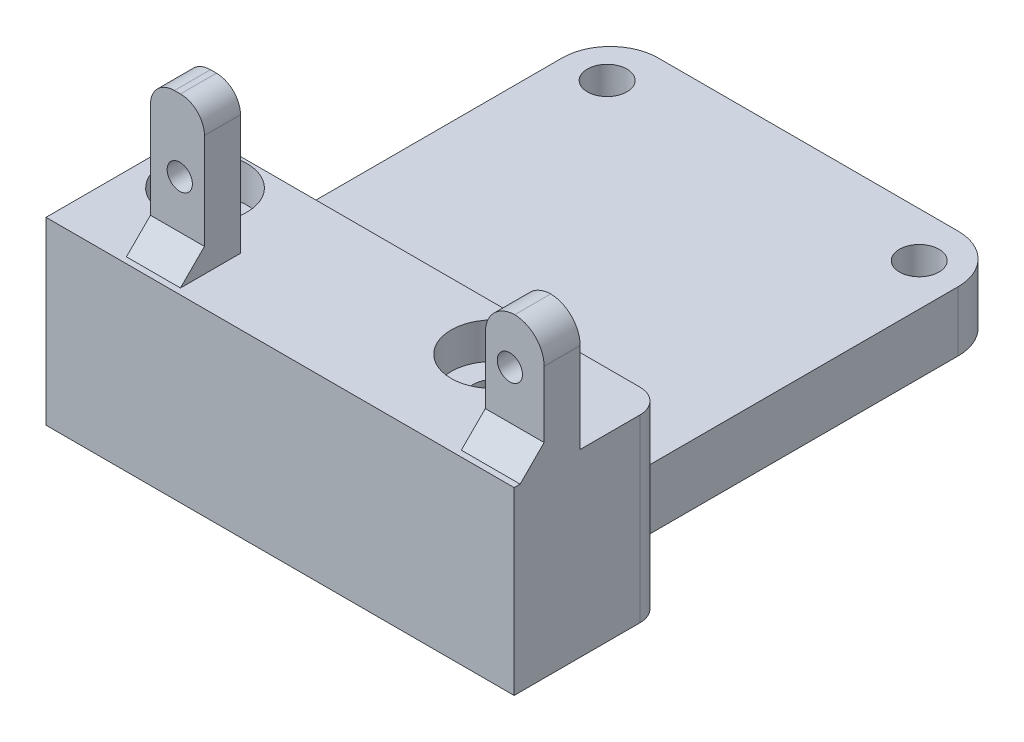
ISO-10303-21;
HEADER;
FILE_DESCRIPTION(('STEP AP214'),'2;1');
FILE_NAME('part.step','',(''),(''),'','','');
FILE_SCHEMA(('AUTOMOTIVE_DESIGN { 1 0 10303 214 1 1 1 1 }'));
ENDSEC;
DATA;
#1=APPLICATION_CONTEXT('core data for automotive mechanical design processes');
#2=APPLICATION_PROTOCOL_DEFINITION('international standard','automotive_design',2000,#1);
#3=PRODUCT_CONTEXT('',#1,'mechanical');
#4=PRODUCT('Part','Part','',(#3));
#5=PRODUCT_RELATED_PRODUCT_CATEGORY('part','',(#4));
#6=PRODUCT_DEFINITION_FORMATION('','',#4);
#7=PRODUCT_DEFINITION_CONTEXT('part definition',#1,'design');
#8=PRODUCT_DEFINITION('design','',#6,#7);
#9=PRODUCT_DEFINITION_SHAPE('','',#8);
#10=(LENGTH_UNIT() NAMED_UNIT(*) SI_UNIT(.MILLI.,.METRE.));
#11=(NAMED_UNIT(*) PLANE_ANGLE_UNIT() SI_UNIT($,.RADIAN.));
#12=(NAMED_UNIT(*) SI_UNIT($,.STERADIAN.) SOLID_ANGLE_UNIT());
#13=UNCERTAINTY_MEASURE_WITH_UNIT(LENGTH_MEASURE(1.E-05),#10,'distance_accuracy_value','');
#14=(GEOMETRIC_REPRESENTATION_CONTEXT(3) GLOBAL_UNCERTAINTY_ASSIGNED_CONTEXT((#13)) GLOBAL_UNIT_ASSIGNED_CONTEXT((#10,
#11,#12)) REPRESENTATION_CONTEXT('',''));
#15=CARTESIAN_POINT('',(0.,0.,0.));
#16=DIRECTION('',(0.,0.,1.));
#17=DIRECTION('',(1.,0.,0.));
#18=AXIS2_PLACEMENT_3D('',#15,#16,#17);
#19=CARTESIAN_POINT('',(0.,15.,0.));
#20=DIRECTION('',(0.,1.,0.));
#21=DIRECTION('',(0.,0.,1.));
#22=AXIS2_PLACEMENT_3D('',#19,#20,#21);
#23=PLANE('',#22);
#24=CARTESIAN_POINT('',(4.50000017881395,15.,-3.75));
#25=DIRECTION('',(0.,1.,0.));
#26=DIRECTION('',(0.,0.,1.));
#27=AXIS2_PLACEMENT_3D('',#24,#25,#26);
#28=CIRCLE('',#27,3.5);
#29=CARTESIAN_POINT('',(4.50000017881395,15.,-0.250000000000003));
#30=VERTEX_POINT('',#29);
#31=EDGE_CURVE('E266',#30,#30,#28,.T.);
#32=ORIENTED_EDGE('',*,*,#31,.F.);
#33=EDGE_LOOP('',(#32));
#34=FACE_BOUND('',#33,.T.);
#35=CARTESIAN_POINT('',(28.5,15.,-3.75));
#36=DIRECTION('',(0.,1.,0.));
#37=DIRECTION('',(0.,0.,1.));
#38=AXIS2_PLACEMENT_3D('',#35,#36,#37);
#39=CIRCLE('',#38,3.5);
#40=CARTESIAN_POINT('',(28.5,15.,-0.250000000000003));
#41=VERTEX_POINT('',#40);
#42=EDGE_CURVE('E272',#41,#41,#39,.T.);
#43=ORIENTED_EDGE('',*,*,#42,.F.);
#44=EDGE_LOOP('',(#43));
#45=FACE_BOUND('',#44,.T.);
#46=DIRECTION('',(0.,0.,-1.));
#47=VECTOR('',#46,1.);
#48=CARTESIAN_POINT('',(39.,15.,5.));
#49=LINE('',#48,#47);
#50=CARTESIAN_POINT('',(39.,15.,5.));
#51=VERTEX_POINT('',#50);
#52=CARTESIAN_POINT('',(39.,15.,4.50000000000001));
#53=VERTEX_POINT('',#52);
#54=EDGE_CURVE('E312',#51,#53,#49,.T.);
#55=ORIENTED_EDGE('',*,*,#54,.T.);
#56=DIRECTION('',(-1.,0.,0.));
#57=VECTOR('',#56,1.);
#58=CARTESIAN_POINT('',(0.,15.,4.50000000000001));
#59=LINE('',#58,#57);
#60=CARTESIAN_POINT('',(34.1,15.,4.50000000000001));
#61=VERTEX_POINT('',#60);
#62=EDGE_CURVE('E442',#53,#61,#59,.T.);
#63=ORIENTED_EDGE('',*,*,#62,.T.);
#64=DIRECTION('',(0.,0.,1.));
#65=VECTOR('',#64,1.);
#66=CARTESIAN_POINT('',(34.1,15.,-0.499999999999995));
#67=LINE('',#66,#65);
#68=CARTESIAN_POINT('',(34.1,15.,-0.499999999999995));
#69=VERTEX_POINT('',#68);
#70=EDGE_CURVE('E298',#69,#61,#67,.T.);
#71=ORIENTED_EDGE('',*,*,#70,.F.);
#72=DIRECTION('',(-1.,0.,0.));
#73=VECTOR('',#72,1.);
#74=CARTESIAN_POINT('',(39.,15.,-0.499999999999996));
#75=LINE('',#74,#73);
#76=CARTESIAN_POINT('',(39.,15.,-0.499999999999994));
#77=VERTEX_POINT('',#76);
#78=EDGE_CURVE('E295',#77,#69,#75,.T.);
#79=ORIENTED_EDGE('',*,*,#78,.F.);
#80=CARTESIAN_POINT('',(39.,15.,-5.49069428315726));
#81=VERTEX_POINT('',#80);
#82=EDGE_CURVE('E311',#77,#81,#49,.T.);
#83=ORIENTED_EDGE('',*,*,#82,.T.);
#84=CARTESIAN_POINT('',(37.,15.,-5.49069428315726));
#85=DIRECTION('',(0.,1.,0.));
#86=DIRECTION('',(0.,0.,1.));
#87=AXIS2_PLACEMENT_3D('',#84,#85,#86);
#88=CIRCLE('',#87,2.);
#89=CARTESIAN_POINT('',(37.,15.,-7.49069428315726));
#90=VERTEX_POINT('',#89);
#91=EDGE_CURVE('E400',#81,#90,#88,.T.);
#92=ORIENTED_EDGE('',*,*,#91,.T.);
#93=DIRECTION('',(-1.,0.,0.));
#94=VECTOR('',#93,1.);
#95=CARTESIAN_POINT('',(39.,15.,-7.49069428315726));
#96=LINE('',#95,#94);
#97=CARTESIAN_POINT('',(0.,15.,-7.49069428315726));
#98=VERTEX_POINT('',#97);
#99=EDGE_CURVE('E315',#90,#98,#96,.T.);
#100=ORIENTED_EDGE('',*,*,#99,.T.);
#101=DIRECTION('',(0.,0.,1.));
#102=VECTOR('',#101,1.);
#103=CARTESIAN_POINT('',(0.,15.,-42.));
#104=LINE('',#103,#102);
#105=CARTESIAN_POINT('',(0.,15.,5.));
#106=VERTEX_POINT('',#105);
#107=EDGE_CURVE('E318',#98,#106,#104,.T.);
#108=ORIENTED_EDGE('',*,*,#107,.T.);
#109=DIRECTION('',(1.,0.,0.));
#110=VECTOR('',#109,1.);
#111=CARTESIAN_POINT('',(0.,15.,5.));
#112=LINE('',#111,#110);
#113=EDGE_CURVE('E320',#106,#51,#112,.T.);
#114=ORIENTED_EDGE('',*,*,#113,.T.);
#115=EDGE_LOOP('',(#55,#63,#71,#79,#83,#92,#100,#108,#114));
#116=FACE_BOUND('',#115,.T.);
#117=DIRECTION('',(0.,0.,-1.));
#118=VECTOR('',#117,1.);
#119=CARTESIAN_POINT('',(10.7,15.,-0.499999999999992));
#120=LINE('',#119,#118);
#121=CARTESIAN_POINT('',(10.7,15.,4.50000000000001));
#122=VERTEX_POINT('',#121);
#123=CARTESIAN_POINT('',(10.7,15.,-0.499999999999992));
#124=VERTEX_POINT('',#123);
#125=EDGE_CURVE('E242',#122,#124,#120,.T.);
#126=ORIENTED_EDGE('',*,*,#125,.F.);
#127=DIRECTION('',(-1.,0.,0.));
#128=VECTOR('',#127,1.);
#129=CARTESIAN_POINT('',(0.,15.,4.50000000000001));
#130=LINE('',#129,#128);
#131=CARTESIAN_POINT('',(6.2,15.,4.50000000000001));
#132=VERTEX_POINT('',#131);
#133=EDGE_CURVE('E440',#122,#132,#130,.T.);
#134=ORIENTED_EDGE('',*,*,#133,.T.);
#135=DIRECTION('',(0.,0.,1.));
#136=VECTOR('',#135,1.);
#137=CARTESIAN_POINT('',(6.2,15.,-0.499999999999991));
#138=LINE('',#137,#136);
#139=CARTESIAN_POINT('',(6.2,15.,-0.499999999999991));
#140=VERTEX_POINT('',#139);
#141=EDGE_CURVE('E249',#140,#132,#138,.T.);
#142=ORIENTED_EDGE('',*,*,#141,.F.);
#143=DIRECTION('',(-1.,0.,0.));
#144=VECTOR('',#143,1.);
#145=CARTESIAN_POINT('',(10.7,15.,-0.499999999999992));
#146=LINE('',#145,#144);
#147=EDGE_CURVE('E231',#124,#140,#146,.T.);
#148=ORIENTED_EDGE('',*,*,#147,.F.);
#149=EDGE_LOOP('',(#126,#134,#142,#148));
#150=FACE_BOUND('',#149,.T.);
#151=ADVANCED_FACE('F64',(#34,#45,#116,#150),#23,.T.);
#152=CARTESIAN_POINT('',(4.50000017881395,-5.,-3.75));
#153=DIRECTION('',(0.,1.,0.));
#154=DIRECTION('',(0.,0.,1.));
#155=AXIS2_PLACEMENT_3D('',#152,#153,#154);
#156=CYLINDRICAL_SURFACE('',#155,1.65000000000001);
#157=CARTESIAN_POINT('',(4.50000017881395,0.,-3.75));
#158=DIRECTION('',(0.,-1.,0.));
#159=DIRECTION('',(0.,0.,-1.));
#160=AXIS2_PLACEMENT_3D('',#157,#158,#159);
#161=CIRCLE('',#160,1.65000000000001);
#162=CARTESIAN_POINT('',(4.50000017881395,0.,-5.40000000000001));
#163=VERTEX_POINT('',#162);
#164=EDGE_CURVE('E332',#163,#163,#161,.T.);
#165=ORIENTED_EDGE('',*,*,#164,.T.);
#166=EDGE_LOOP('',(#165));
#167=FACE_BOUND('',#166,.T.);
#168=CARTESIAN_POINT('',(4.50000017881395,12.,-3.75));
#169=DIRECTION('',(0.,1.,0.));
#170=DIRECTION('',(0.,0.,1.));
#171=AXIS2_PLACEMENT_3D('',#168,#169,#170);
#172=CIRCLE('',#171,1.65000000000001);
#173=CARTESIAN_POINT('',(4.50000017881395,12.,-2.1));
#174=VERTEX_POINT('',#173);
#175=EDGE_CURVE('E279',#174,#174,#172,.F.);
#176=ORIENTED_EDGE('',*,*,#175,.F.);
#177=EDGE_LOOP('',(#176));
#178=FACE_BOUND('',#177,.T.);
#179=ADVANCED_FACE('F534',(#167,#178),#156,.F.);
#180=CARTESIAN_POINT('',(28.5,-5.,-3.75));
#181=DIRECTION('',(0.,1.,0.));
#182=DIRECTION('',(0.,0.,1.));
#183=AXIS2_PLACEMENT_3D('',#180,#181,#182);
#184=CYLINDRICAL_SURFACE('',#183,1.65000000000001);
#185=CARTESIAN_POINT('',(28.5,0.,-3.75));
#186=DIRECTION('',(0.,-1.,0.));
#187=DIRECTION('',(0.,0.,-1.));
#188=AXIS2_PLACEMENT_3D('',#185,#186,#187);
#189=CIRCLE('',#188,1.65000000000001);
#190=CARTESIAN_POINT('',(28.5,0.,-5.40000000000001));
#191=VERTEX_POINT('',#190);
#192=EDGE_CURVE('E338',#191,#191,#189,.T.);
#193=ORIENTED_EDGE('',*,*,#192,.T.);
#194=EDGE_LOOP('',(#193));
#195=FACE_BOUND('',#194,.T.);
#196=CARTESIAN_POINT('',(28.5,12.,-3.75));
#197=DIRECTION('',(0.,1.,0.));
#198=DIRECTION('',(0.,0.,1.));
#199=AXIS2_PLACEMENT_3D('',#196,#197,#198);
#200=CIRCLE('',#199,1.65000000000001);
#201=CARTESIAN_POINT('',(28.5,12.,-2.1));
#202=VERTEX_POINT('',#201);
#203=EDGE_CURVE('E265',#202,#202,#200,.F.);
#204=ORIENTED_EDGE('',*,*,#203,.F.);
#205=EDGE_LOOP('',(#204));
#206=FACE_BOUND('',#205,.T.);
#207=ADVANCED_FACE('F542',(#195,#206),#184,.F.);
#208=CARTESIAN_POINT('',(33.,5.,0.));
#209=DIRECTION('',(-1.,0.,0.));
#210=DIRECTION('',(0.,0.,1.));
#211=AXIS2_PLACEMENT_3D('',#208,#209,#210);
#212=PLANE('',#211);
#213=DIRECTION('',(0.,0.,-1.));
#214=VECTOR('',#213,1.);
#215=CARTESIAN_POINT('',(33.,5.,-42.));
#216=LINE('',#215,#214);
#217=CARTESIAN_POINT('',(33.,5.,-11.4906942831573));
#218=VERTEX_POINT('',#217);
#219=CARTESIAN_POINT('',(33.,5.,-38.));
#220=VERTEX_POINT('',#219);
#221=EDGE_CURVE('E278',#218,#220,#216,.T.);
#222=ORIENTED_EDGE('',*,*,#221,.F.);
#223=DIRECTION('',(0.,1.,0.));
#224=VECTOR('',#223,1.);
#225=CARTESIAN_POINT('',(33.,0.,-11.4906942831573));
#226=LINE('',#225,#224);
#227=CARTESIAN_POINT('',(33.,0.,-11.4906942831573));
#228=VERTEX_POINT('',#227);
#229=EDGE_CURVE('E377',#218,#228,#226,.F.);
#230=ORIENTED_EDGE('',*,*,#229,.T.);
#231=DIRECTION('',(0.,0.,-1.));
#232=VECTOR('',#231,1.);
#233=CARTESIAN_POINT('',(33.,0.,0.));
#234=LINE('',#233,#232);
#235=CARTESIAN_POINT('',(33.,0.,-38.));
#236=VERTEX_POINT('',#235);
#237=EDGE_CURVE('E337',#228,#236,#234,.T.);
#238=ORIENTED_EDGE('',*,*,#237,.T.);
#239=DIRECTION('',(0.,-1.,0.));
#240=VECTOR('',#239,1.);
#241=CARTESIAN_POINT('',(33.,5.,-38.));
#242=LINE('',#241,#240);
#243=EDGE_CURVE('E375',#236,#220,#242,.F.);
#244=ORIENTED_EDGE('',*,*,#243,.T.);
#245=EDGE_LOOP('',(#222,#230,#238,#244));
#246=FACE_BOUND('',#245,.T.);
#247=ADVANCED_FACE('F503',(#246),#212,.F.);
#248=CARTESIAN_POINT('',(0.,5.,-42.));
#249=DIRECTION('',(0.,0.,1.));
#250=DIRECTION('',(1.,0.,0.));
#251=AXIS2_PLACEMENT_3D('',#248,#249,#250);
#252=PLANE('',#251);
#253=DIRECTION('',(-1.,0.,0.));
#254=VECTOR('',#253,1.);
#255=CARTESIAN_POINT('',(0.,0.,-42.));
#256=LINE('',#255,#254);
#257=CARTESIAN_POINT('',(29.,0.,-42.));
#258=VERTEX_POINT('',#257);
#259=CARTESIAN_POINT('',(4.,0.,-42.));
#260=VERTEX_POINT('',#259);
#261=EDGE_CURVE('E341',#258,#260,#256,.T.);
#262=ORIENTED_EDGE('',*,*,#261,.T.);
#263=DIRECTION('',(0.,-1.,0.));
#264=VECTOR('',#263,1.);
#265=CARTESIAN_POINT('',(4.,5.,-42.));
#266=LINE('',#265,#264);
#267=CARTESIAN_POINT('',(4.,5.,-42.));
#268=VERTEX_POINT('',#267);
#269=EDGE_CURVE('E389',#260,#268,#266,.F.);
#270=ORIENTED_EDGE('',*,*,#269,.T.);
#271=DIRECTION('',(-1.,0.,0.));
#272=VECTOR('',#271,1.);
#273=CARTESIAN_POINT('',(0.,5.,-42.));
#274=LINE('',#273,#272);
#275=CARTESIAN_POINT('',(29.,5.,-42.));
#276=VERTEX_POINT('',#275);
#277=EDGE_CURVE('E282',#276,#268,#274,.T.);
#278=ORIENTED_EDGE('',*,*,#277,.F.);
#279=DIRECTION('',(0.,-1.,0.));
#280=VECTOR('',#279,1.);
#281=CARTESIAN_POINT('',(29.,5.,-42.));
#282=LINE('',#281,#280);
#283=EDGE_CURVE('E386',#276,#258,#282,.T.);
#284=ORIENTED_EDGE('',*,*,#283,.T.);
#285=EDGE_LOOP('',(#262,#270,#278,#284));
#286=FACE_BOUND('',#285,.T.);
#287=ADVANCED_FACE('F519',(#286),#252,.F.);
#288=CARTESIAN_POINT('',(3.50000017881394,-5.,-38.2499994337559));
#289=DIRECTION('',(0.,1.,0.));
#290=DIRECTION('',(0.,0.,1.));
#291=AXIS2_PLACEMENT_3D('',#288,#289,#290);
#292=CYLINDRICAL_SURFACE('',#291,1.65000000000001);
#293=CARTESIAN_POINT('',(3.50000017881394,0.,-38.2499994337559));
#294=DIRECTION('',(0.,-1.,0.));
#295=DIRECTION('',(0.,0.,-1.));
#296=AXIS2_PLACEMENT_3D('',#293,#294,#295);
#297=CIRCLE('',#296,1.65000000000001);
#298=CARTESIAN_POINT('',(3.50000017881394,0.,-39.8999994337559));
#299=VERTEX_POINT('',#298);
#300=EDGE_CURVE('E347',#299,#299,#297,.T.);
#301=ORIENTED_EDGE('',*,*,#300,.T.);
#302=EDGE_LOOP('',(#301));
#303=FACE_BOUND('',#302,.T.);
#304=CARTESIAN_POINT('',(3.50000017881394,5.,-38.2499994337559));
#305=DIRECTION('',(0.,1.,0.));
#306=DIRECTION('',(0.,0.,1.));
#307=AXIS2_PLACEMENT_3D('',#304,#305,#306);
#308=CIRCLE('',#307,1.65000000000001);
#309=CARTESIAN_POINT('',(3.50000017881394,5.,-36.5999994337559));
#310=VERTEX_POINT('',#309);
#311=EDGE_CURVE('E288',#310,#310,#308,.F.);
#312=ORIENTED_EDGE('',*,*,#311,.F.);
#313=EDGE_LOOP('',(#312));
#314=FACE_BOUND('',#313,.T.);
#315=ADVANCED_FACE('F556',(#303,#314),#292,.F.);
#316=CARTESIAN_POINT('',(29.5,-5.,-38.2499994337559));
#317=DIRECTION('',(0.,1.,0.));
#318=DIRECTION('',(0.,0.,1.));
#319=AXIS2_PLACEMENT_3D('',#316,#317,#318);
#320=CYLINDRICAL_SURFACE('',#319,1.65000000000001);
#321=CARTESIAN_POINT('',(29.5,0.,-38.2499994337559));
#322=DIRECTION('',(0.,-1.,0.));
#323=DIRECTION('',(0.,0.,-1.));
#324=AXIS2_PLACEMENT_3D('',#321,#322,#323);
#325=CIRCLE('',#324,1.65000000000001);
#326=CARTESIAN_POINT('',(29.5,0.,-39.8999994337559));
#327=VERTEX_POINT('',#326);
#328=EDGE_CURVE('E350',#327,#327,#325,.T.);
#329=ORIENTED_EDGE('',*,*,#328,.T.);
#330=EDGE_LOOP('',(#329));
#331=FACE_BOUND('',#330,.T.);
#332=CARTESIAN_POINT('',(29.5,5.,-38.2499994337559));
#333=DIRECTION('',(0.,1.,0.));
#334=DIRECTION('',(0.,0.,1.));
#335=AXIS2_PLACEMENT_3D('',#332,#333,#334);
#336=CIRCLE('',#335,1.65000000000001);
#337=CARTESIAN_POINT('',(29.5,5.,-36.5999994337559));
#338=VERTEX_POINT('',#337);
#339=EDGE_CURVE('E287',#338,#338,#336,.F.);
#340=ORIENTED_EDGE('',*,*,#339,.F.);
#341=EDGE_LOOP('',(#340));
#342=FACE_BOUND('',#341,.T.);
#343=ADVANCED_FACE('F559',(#331,#342),#320,.F.);
#344=CARTESIAN_POINT('',(0.,5.,0.));
#345=DIRECTION('',(1.,0.,0.));
#346=DIRECTION('',(0.,0.,-1.));
#347=AXIS2_PLACEMENT_3D('',#344,#345,#346);
#348=PLANE('',#347);
#349=DIRECTION('',(0.,0.,1.));
#350=VECTOR('',#349,1.);
#351=CARTESIAN_POINT('',(0.,5.,-42.));
#352=LINE('',#351,#350);
#353=CARTESIAN_POINT('',(0.,5.,-38.));
#354=VERTEX_POINT('',#353);
#355=CARTESIAN_POINT('',(0.,5.,-11.4906942831573));
#356=VERTEX_POINT('',#355);
#357=EDGE_CURVE('E275',#354,#356,#352,.T.);
#358=ORIENTED_EDGE('',*,*,#357,.F.);
#359=DIRECTION('',(0.,-1.,0.));
#360=VECTOR('',#359,1.);
#361=CARTESIAN_POINT('',(0.,5.,-38.));
#362=LINE('',#361,#360);
#363=CARTESIAN_POINT('',(0.,0.,-38.));
#364=VERTEX_POINT('',#363);
#365=EDGE_CURVE('E379',#354,#364,#362,.T.);
#366=ORIENTED_EDGE('',*,*,#365,.T.);
#367=DIRECTION('',(0.,0.,1.));
#368=VECTOR('',#367,1.);
#369=CARTESIAN_POINT('',(0.,0.,0.));
#370=LINE('',#369,#368);
#371=CARTESIAN_POINT('',(0.,0.,5.));
#372=VERTEX_POINT('',#371);
#373=EDGE_CURVE('E335',#364,#372,#370,.T.);
#374=ORIENTED_EDGE('',*,*,#373,.T.);
#375=DIRECTION('',(0.,1.,0.));
#376=VECTOR('',#375,1.);
#377=CARTESIAN_POINT('',(0.,0.,5.));
#378=LINE('',#377,#376);
#379=EDGE_CURVE('E329',#372,#106,#378,.T.);
#380=ORIENTED_EDGE('',*,*,#379,.T.);
#381=ORIENTED_EDGE('',*,*,#107,.F.);
#382=DIRECTION('',(0.,1.,0.));
#383=VECTOR('',#382,1.);
#384=CARTESIAN_POINT('',(0.,5.,-7.49069428315726));
#385=LINE('',#384,#383);
#386=CARTESIAN_POINT('',(0.,9.,-7.49069428315726));
#387=VERTEX_POINT('',#386);
#388=EDGE_CURVE('E285',#387,#98,#385,.T.);
#389=ORIENTED_EDGE('',*,*,#388,.F.);
#390=CARTESIAN_POINT('',(0.,9.,-11.4906942831573));
#391=DIRECTION('',(1.,0.,0.));
#392=DIRECTION('',(0.,0.,-1.));
#393=AXIS2_PLACEMENT_3D('',#390,#391,#392);
#394=CIRCLE('',#393,4.);
#395=EDGE_CURVE('E415',#387,#356,#394,.T.);
#396=ORIENTED_EDGE('',*,*,#395,.T.);
#397=EDGE_LOOP('',(#358,#366,#374,#380,#381,#389,#396));
#398=FACE_BOUND('',#397,.T.);
#399=ADVANCED_FACE('F492',(#398),#348,.F.);
#400=CARTESIAN_POINT('',(0.,0.,0.));
#401=DIRECTION('',(0.,-1.,0.));
#402=DIRECTION('',(0.,0.,-1.));
#403=AXIS2_PLACEMENT_3D('',#400,#401,#402);
#404=PLANE('',#403);
#405=CARTESIAN_POINT('',(37.,0.,-11.4906942831573));
#406=DIRECTION('',(0.,-1.,0.));
#407=DIRECTION('',(0.,0.,-1.));
#408=AXIS2_PLACEMENT_3D('',#405,#406,#407);
#409=CIRCLE('',#408,4.);
#410=CARTESIAN_POINT('',(37.,0.,-7.49069428315726));
#411=VERTEX_POINT('',#410);
#412=EDGE_CURVE('E395',#228,#411,#409,.F.);
#413=ORIENTED_EDGE('',*,*,#412,.T.);
#414=CARTESIAN_POINT('',(37.,0.,-5.49069428315726));
#415=DIRECTION('',(0.,-1.,0.));
#416=DIRECTION('',(0.,0.,-1.));
#417=AXIS2_PLACEMENT_3D('',#414,#415,#416);
#418=CIRCLE('',#417,2.);
#419=CARTESIAN_POINT('',(39.,0.,-5.49069428315726));
#420=VERTEX_POINT('',#419);
#421=EDGE_CURVE('E405',#411,#420,#418,.T.);
#422=ORIENTED_EDGE('',*,*,#421,.T.);
#423=DIRECTION('',(0.,0.,-1.));
#424=VECTOR('',#423,1.);
#425=CARTESIAN_POINT('',(39.,0.,0.));
#426=LINE('',#425,#424);
#427=CARTESIAN_POINT('',(39.,0.,5.));
#428=VERTEX_POINT('',#427);
#429=EDGE_CURVE('E326',#428,#420,#426,.T.);
#430=ORIENTED_EDGE('',*,*,#429,.F.);
#431=DIRECTION('',(-1.,0.,0.));
#432=VECTOR('',#431,1.);
#433=CARTESIAN_POINT('',(0.,0.,5.));
#434=LINE('',#433,#432);
#435=EDGE_CURVE('E323',#428,#372,#434,.T.);
#436=ORIENTED_EDGE('',*,*,#435,.T.);
#437=ORIENTED_EDGE('',*,*,#373,.F.);
#438=CARTESIAN_POINT('',(4.,0.,-38.));
#439=DIRECTION('',(0.,-1.,0.));
#440=DIRECTION('',(0.,0.,-1.));
#441=AXIS2_PLACEMENT_3D('',#438,#439,#440);
#442=CIRCLE('',#441,4.);
#443=EDGE_CURVE('E384',#364,#260,#442,.T.);
#444=ORIENTED_EDGE('',*,*,#443,.T.);
#445=ORIENTED_EDGE('',*,*,#261,.F.);
#446=CARTESIAN_POINT('',(29.,0.,-38.));
#447=DIRECTION('',(0.,-1.,0.));
#448=DIRECTION('',(0.,0.,-1.));
#449=AXIS2_PLACEMENT_3D('',#446,#447,#448);
#450=CIRCLE('',#449,4.);
#451=EDGE_CURVE('E382',#258,#236,#450,.T.);
#452=ORIENTED_EDGE('',*,*,#451,.T.);
#453=ORIENTED_EDGE('',*,*,#237,.F.);
#454=EDGE_LOOP('',(#413,#422,#430,#436,#437,#444,#445,#452,#453));
#455=FACE_BOUND('',#454,.T.);
#456=ORIENTED_EDGE('',*,*,#192,.F.);
#457=EDGE_LOOP('',(#456));
#458=FACE_BOUND('',#457,.T.);
#459=ORIENTED_EDGE('',*,*,#328,.F.);
#460=EDGE_LOOP('',(#459));
#461=FACE_BOUND('',#460,.T.);
#462=ORIENTED_EDGE('',*,*,#300,.F.);
#463=EDGE_LOOP('',(#462));
#464=FACE_BOUND('',#463,.T.);
#465=ORIENTED_EDGE('',*,*,#164,.F.);
#466=EDGE_LOOP('',(#465));
#467=FACE_BOUND('',#466,.T.);
#468=ADVANCED_FACE('F510',(#455,#458,#461,#464,#467),#404,.T.);
#469=CARTESIAN_POINT('',(0.,0.,-7.49069428315726));
#470=DIRECTION('',(0.,0.,1.));
#471=DIRECTION('',(1.,0.,0.));
#472=AXIS2_PLACEMENT_3D('',#469,#470,#471);
#473=PLANE('',#472);
#474=DIRECTION('',(0.,1.,0.));
#475=VECTOR('',#474,1.);
#476=CARTESIAN_POINT('',(37.,0.,-7.49069428315726));
#477=LINE('',#476,#475);
#478=CARTESIAN_POINT('',(37.,9.,-7.49069428315726));
#479=VERTEX_POINT('',#478);
#480=EDGE_CURVE('E402',#90,#479,#477,.F.);
#481=ORIENTED_EDGE('',*,*,#480,.T.);
#482=DIRECTION('',(1.,0.,0.));
#483=VECTOR('',#482,1.);
#484=CARTESIAN_POINT('',(0.,9.,-7.49069428315726));
#485=LINE('',#484,#483);
#486=EDGE_CURVE('E410',#479,#387,#485,.F.);
#487=ORIENTED_EDGE('',*,*,#486,.T.);
#488=ORIENTED_EDGE('',*,*,#388,.T.);
#489=ORIENTED_EDGE('',*,*,#99,.F.);
#490=EDGE_LOOP('',(#481,#487,#488,#489));
#491=FACE_BOUND('',#490,.T.);
#492=ADVANCED_FACE('F486',(#491),#473,.F.);
#493=CARTESIAN_POINT('',(39.,0.,0.));
#494=DIRECTION('',(1.,0.,0.));
#495=DIRECTION('',(0.,0.,-1.));
#496=AXIS2_PLACEMENT_3D('',#493,#494,#495);
#497=PLANE('',#496);
#498=ORIENTED_EDGE('',*,*,#429,.T.);
#499=DIRECTION('',(0.,1.,0.));
#500=VECTOR('',#499,1.);
#501=CARTESIAN_POINT('',(39.,15.,-5.49069428315726));
#502=LINE('',#501,#500);
#503=EDGE_CURVE('E397',#420,#81,#502,.T.);
#504=ORIENTED_EDGE('',*,*,#503,.T.);
#505=ORIENTED_EDGE('',*,*,#82,.F.);
#506=DIRECTION('',(0.,-1.,0.));
#507=VECTOR('',#506,1.);
#508=CARTESIAN_POINT('',(39.,25.,-0.499999999999996));
#509=LINE('',#508,#507);
#510=CARTESIAN_POINT('',(39.,22.5,-0.499999999999996));
#511=VERTEX_POINT('',#510);
#512=EDGE_CURVE('E309',#511,#77,#509,.T.);
#513=ORIENTED_EDGE('',*,*,#512,.F.);
#514=DIRECTION('',(0.,0.,-1.));
#515=VECTOR('',#514,1.);
#516=CARTESIAN_POINT('',(39.,22.5,2.5));
#517=LINE('',#516,#515);
#518=CARTESIAN_POINT('',(39.,22.5,2.5));
#519=VERTEX_POINT('',#518);
#520=EDGE_CURVE('E365',#511,#519,#517,.F.);
#521=ORIENTED_EDGE('',*,*,#520,.T.);
#522=DIRECTION('',(0.,-1.,0.));
#523=VECTOR('',#522,1.);
#524=CARTESIAN_POINT('',(39.,25.,2.5));
#525=LINE('',#524,#523);
#526=CARTESIAN_POINT('',(39.,17.,2.5));
#527=VERTEX_POINT('',#526);
#528=EDGE_CURVE('E301',#519,#527,#525,.T.);
#529=ORIENTED_EDGE('',*,*,#528,.T.);
#530=DIRECTION('',(0.,-0.707106781186551,0.707106781186544));
#531=VECTOR('',#530,1.);
#532=CARTESIAN_POINT('',(39.,17.,2.5));
#533=LINE('',#532,#531);
#534=EDGE_CURVE('E447',#527,#53,#533,.T.);
#535=ORIENTED_EDGE('',*,*,#534,.T.);
#536=ORIENTED_EDGE('',*,*,#54,.F.);
#537=DIRECTION('',(0.,1.,0.));
#538=VECTOR('',#537,1.);
#539=CARTESIAN_POINT('',(39.,0.,5.));
#540=LINE('',#539,#538);
#541=EDGE_CURVE('E330',#428,#51,#540,.T.);
#542=ORIENTED_EDGE('',*,*,#541,.F.);
#543=EDGE_LOOP('',(#498,#504,#505,#513,#521,#529,#535,#536,#542));
#544=FACE_BOUND('',#543,.T.);
#545=ADVANCED_FACE('F466',(#544),#497,.T.);
#546=CARTESIAN_POINT('',(0.,0.,5.));
#547=DIRECTION('',(0.,0.,-1.));
#548=DIRECTION('',(-1.,0.,0.));
#549=AXIS2_PLACEMENT_3D('',#546,#547,#548);
#550=PLANE('',#549);
#551=ORIENTED_EDGE('',*,*,#541,.T.);
#552=ORIENTED_EDGE('',*,*,#113,.F.);
#553=ORIENTED_EDGE('',*,*,#379,.F.);
#554=ORIENTED_EDGE('',*,*,#435,.F.);
#555=EDGE_LOOP('',(#551,#552,#553,#554));
#556=FACE_BOUND('',#555,.T.);
#557=ADVANCED_FACE('F472',(#556),#550,.F.);
#558=CARTESIAN_POINT('',(39.,25.,-0.499999999999996));
#559=DIRECTION('',(0.,0.,1.));
#560=DIRECTION('',(1.,0.,0.));
#561=AXIS2_PLACEMENT_3D('',#558,#559,#560);
#562=PLANE('',#561);
#563=CARTESIAN_POINT('',(36.1449184549356,21.,-0.499999999999995));
#564=DIRECTION('',(0.,0.,-1.));
#565=DIRECTION('',(-1.,0.,0.));
#566=AXIS2_PLACEMENT_3D('',#563,#564,#565);
#567=CIRCLE('',#566,1.05);
#568=CARTESIAN_POINT('',(35.0949184549356,21.,-0.499999999999995));
#569=VERTEX_POINT('',#568);
#570=EDGE_CURVE('E291',#569,#569,#567,.T.);
#571=ORIENTED_EDGE('',*,*,#570,.F.);
#572=EDGE_LOOP('',(#571));
#573=FACE_BOUND('',#572,.T.);
#574=DIRECTION('',(0.,-1.,0.));
#575=VECTOR('',#574,1.);
#576=CARTESIAN_POINT('',(34.1,25.,-0.499999999999995));
#577=LINE('',#576,#575);
#578=CARTESIAN_POINT('',(34.1,22.5,-0.499999999999995));
#579=VERTEX_POINT('',#578);
#580=EDGE_CURVE('E307',#579,#69,#577,.T.);
#581=ORIENTED_EDGE('',*,*,#580,.F.);
#582=CARTESIAN_POINT('',(36.6,22.5,-0.499999999999996));
#583=DIRECTION('',(0.,0.,1.));
#584=DIRECTION('',(1.,0.,0.));
#585=AXIS2_PLACEMENT_3D('',#582,#583,#584);
#586=CIRCLE('',#585,2.5);
#587=CARTESIAN_POINT('',(36.55,24.99949994999,-0.499999999999996));
#588=VERTEX_POINT('',#587);
#589=EDGE_CURVE('E363',#579,#588,#586,.F.);
#590=ORIENTED_EDGE('',*,*,#589,.T.);
#591=CARTESIAN_POINT('',(36.5,22.5,-0.499999999999996));
#592=DIRECTION('',(0.,0.,1.));
#593=DIRECTION('',(1.,0.,0.));
#594=AXIS2_PLACEMENT_3D('',#591,#592,#593);
#595=CIRCLE('',#594,2.5);
#596=EDGE_CURVE('E361',#588,#511,#595,.F.);
#597=ORIENTED_EDGE('',*,*,#596,.T.);
#598=ORIENTED_EDGE('',*,*,#512,.T.);
#599=ORIENTED_EDGE('',*,*,#78,.T.);
#600=EDGE_LOOP('',(#581,#590,#597,#598,#599));
#601=FACE_BOUND('',#600,.T.);
#602=ADVANCED_FACE('F549',(#573,#601),#562,.F.);
#603=CARTESIAN_POINT('',(34.1,25.,-0.499999999999995));
#604=DIRECTION('',(1.,0.,0.));
#605=DIRECTION('',(0.,0.,-1.));
#606=AXIS2_PLACEMENT_3D('',#603,#604,#605);
#607=PLANE('',#606);
#608=DIRECTION('',(0.,-1.,0.));
#609=VECTOR('',#608,1.);
#610=CARTESIAN_POINT('',(34.1,25.,2.5));
#611=LINE('',#610,#609);
#612=CARTESIAN_POINT('',(34.1,22.5,2.5));
#613=VERTEX_POINT('',#612);
#614=CARTESIAN_POINT('',(34.1,17.,2.5));
#615=VERTEX_POINT('',#614);
#616=EDGE_CURVE('E304',#613,#615,#611,.T.);
#617=ORIENTED_EDGE('',*,*,#616,.F.);
#618=DIRECTION('',(0.,0.,1.));
#619=VECTOR('',#618,1.);
#620=CARTESIAN_POINT('',(34.1,22.5,-0.499999999999995));
#621=LINE('',#620,#619);
#622=EDGE_CURVE('E358',#613,#579,#621,.F.);
#623=ORIENTED_EDGE('',*,*,#622,.T.);
#624=ORIENTED_EDGE('',*,*,#580,.T.);
#625=ORIENTED_EDGE('',*,*,#70,.T.);
#626=DIRECTION('',(0.,0.707106781186551,-0.707106781186544));
#627=VECTOR('',#626,1.);
#628=CARTESIAN_POINT('',(34.1,22.5000000000001,-2.99999999999997));
#629=LINE('',#628,#627);
#630=EDGE_CURVE('E449',#61,#615,#629,.T.);
#631=ORIENTED_EDGE('',*,*,#630,.T.);
#632=EDGE_LOOP('',(#617,#623,#624,#625,#631));
#633=FACE_BOUND('',#632,.T.);
#634=ADVANCED_FACE('F453',(#633),#607,.F.);
#635=CARTESIAN_POINT('',(39.,25.,2.5));
#636=DIRECTION('',(0.,0.,-1.));
#637=DIRECTION('',(-1.,0.,0.));
#638=AXIS2_PLACEMENT_3D('',#635,#636,#637);
#639=PLANE('',#638);
#640=CARTESIAN_POINT('',(36.1449184549356,21.,2.5));
#641=DIRECTION('',(0.,0.,-1.));
#642=DIRECTION('',(-1.,0.,0.));
#643=AXIS2_PLACEMENT_3D('',#640,#641,#642);
#644=CIRCLE('',#643,1.05);
#645=CARTESIAN_POINT('',(35.0949184549356,21.,2.5));
#646=VERTEX_POINT('',#645);
#647=EDGE_CURVE('E294',#646,#646,#644,.T.);
#648=ORIENTED_EDGE('',*,*,#647,.T.);
#649=EDGE_LOOP('',(#648));
#650=FACE_BOUND('',#649,.T.);
#651=ORIENTED_EDGE('',*,*,#616,.T.);
#652=DIRECTION('',(1.,0.,0.));
#653=VECTOR('',#652,1.);
#654=CARTESIAN_POINT('',(39.,17.,2.5));
#655=LINE('',#654,#653);
#656=EDGE_CURVE('E437',#615,#527,#655,.T.);
#657=ORIENTED_EDGE('',*,*,#656,.T.);
#658=ORIENTED_EDGE('',*,*,#528,.F.);
#659=CARTESIAN_POINT('',(36.5,22.5,2.5));
#660=DIRECTION('',(0.,0.,-1.));
#661=DIRECTION('',(-1.,0.,0.));
#662=AXIS2_PLACEMENT_3D('',#659,#660,#661);
#663=CIRCLE('',#662,2.5);
#664=CARTESIAN_POINT('',(36.55,24.99949994999,2.5));
#665=VERTEX_POINT('',#664);
#666=EDGE_CURVE('E344',#519,#665,#663,.F.);
#667=ORIENTED_EDGE('',*,*,#666,.T.);
#668=CARTESIAN_POINT('',(36.6,22.5,2.5));
#669=DIRECTION('',(0.,0.,-1.));
#670=DIRECTION('',(-1.,0.,0.));
#671=AXIS2_PLACEMENT_3D('',#668,#669,#670);
#672=CIRCLE('',#671,2.5);
#673=EDGE_CURVE('E356',#665,#613,#672,.F.);
#674=ORIENTED_EDGE('',*,*,#673,.T.);
#675=EDGE_LOOP('',(#651,#657,#658,#667,#674));
#676=FACE_BOUND('',#675,.T.);
#677=ADVANCED_FACE('F460',(#650,#676),#639,.F.);
#678=CARTESIAN_POINT('',(36.5,22.5,0.));
#679=DIRECTION('',(0.,0.,1.));
#680=DIRECTION('',(1.,0.,0.));
#681=AXIS2_PLACEMENT_3D('',#678,#679,#680);
#682=CYLINDRICAL_SURFACE('',#681,2.5);
#683=ORIENTED_EDGE('',*,*,#520,.F.);
#684=ORIENTED_EDGE('',*,*,#596,.F.);
#685=DIRECTION('',(0.,0.,1.));
#686=VECTOR('',#685,1.);
#687=CARTESIAN_POINT('',(36.55,24.99949994999,1.));
#688=LINE('',#687,#686);
#689=EDGE_CURVE('E299',#665,#588,#688,.F.);
#690=ORIENTED_EDGE('',*,*,#689,.F.);
#691=ORIENTED_EDGE('',*,*,#666,.F.);
#692=EDGE_LOOP('',(#683,#684,#690,#691));
#693=FACE_BOUND('',#692,.T.);
#694=ADVANCED_FACE('F579',(#693),#682,.T.);
#695=CARTESIAN_POINT('',(36.6,22.5,0.));
#696=DIRECTION('',(0.,0.,1.));
#697=DIRECTION('',(1.,0.,0.));
#698=AXIS2_PLACEMENT_3D('',#695,#696,#697);
#699=CYLINDRICAL_SURFACE('',#698,2.5);
#700=ORIENTED_EDGE('',*,*,#589,.F.);
#701=ORIENTED_EDGE('',*,*,#622,.F.);
#702=ORIENTED_EDGE('',*,*,#673,.F.);
#703=ORIENTED_EDGE('',*,*,#689,.T.);
#704=EDGE_LOOP('',(#700,#701,#702,#703));
#705=FACE_BOUND('',#704,.T.);
#706=ADVANCED_FACE('F575',(#705),#699,.T.);
#707=CARTESIAN_POINT('',(36.1449184549356,21.,9.50000000000001));
#708=DIRECTION('',(0.,0.,-1.));
#709=DIRECTION('',(-1.,0.,0.));
#710=AXIS2_PLACEMENT_3D('',#707,#708,#709);
#711=CYLINDRICAL_SURFACE('',#710,1.05);
#712=ORIENTED_EDGE('',*,*,#570,.T.);
#713=EDGE_LOOP('',(#712));
#714=FACE_BOUND('',#713,.T.);
#715=ORIENTED_EDGE('',*,*,#647,.F.);
#716=EDGE_LOOP('',(#715));
#717=FACE_BOUND('',#716,.T.);
#718=ADVANCED_FACE('F578',(#714,#717),#711,.F.);
#719=CARTESIAN_POINT('',(0.,5.,0.));
#720=DIRECTION('',(0.,1.,0.));
#721=DIRECTION('',(0.,0.,1.));
#722=AXIS2_PLACEMENT_3D('',#719,#720,#721);
#723=PLANE('',#722);
#724=ORIENTED_EDGE('',*,*,#357,.T.);
#725=DIRECTION('',(1.,0.,0.));
#726=VECTOR('',#725,1.);
#727=CARTESIAN_POINT('',(0.,5.,-11.4906942831573));
#728=LINE('',#727,#726);
#729=EDGE_CURVE('E407',#356,#218,#728,.T.);
#730=ORIENTED_EDGE('',*,*,#729,.T.);
#731=ORIENTED_EDGE('',*,*,#221,.T.);
#732=CARTESIAN_POINT('',(29.,5.,-38.));
#733=DIRECTION('',(0.,1.,0.));
#734=DIRECTION('',(0.,0.,1.));
#735=AXIS2_PLACEMENT_3D('',#732,#733,#734);
#736=CIRCLE('',#735,4.);
#737=EDGE_CURVE('E391',#220,#276,#736,.T.);
#738=ORIENTED_EDGE('',*,*,#737,.T.);
#739=ORIENTED_EDGE('',*,*,#277,.T.);
#740=CARTESIAN_POINT('',(4.,5.,-38.));
#741=DIRECTION('',(0.,1.,0.));
#742=DIRECTION('',(0.,0.,1.));
#743=AXIS2_PLACEMENT_3D('',#740,#741,#742);
#744=CIRCLE('',#743,4.);
#745=EDGE_CURVE('E393',#268,#354,#744,.T.);
#746=ORIENTED_EDGE('',*,*,#745,.T.);
#747=EDGE_LOOP('',(#724,#730,#731,#738,#739,#746));
#748=FACE_BOUND('',#747,.T.);
#749=ORIENTED_EDGE('',*,*,#339,.T.);
#750=EDGE_LOOP('',(#749));
#751=FACE_BOUND('',#750,.T.);
#752=ORIENTED_EDGE('',*,*,#311,.T.);
#753=EDGE_LOOP('',(#752));
#754=FACE_BOUND('',#753,.T.);
#755=ADVANCED_FACE('F498',(#748,#751,#754),#723,.T.);
#756=CARTESIAN_POINT('',(37.,0.,-11.4906942831573));
#757=DIRECTION('',(0.,-1.,0.));
#758=DIRECTION('',(0.,0.,-1.));
#759=AXIS2_PLACEMENT_3D('',#756,#757,#758);
#760=CYLINDRICAL_SURFACE('',#759,4.);
#761=ORIENTED_EDGE('',*,*,#412,.F.);
#762=ORIENTED_EDGE('',*,*,#229,.F.);
#763=CARTESIAN_POINT('',(37.,9.,-11.4906942831573));
#764=DIRECTION('',(0.707106781186547,-0.707106781186547,0.));
#765=DIRECTION('',(-0.707106781186547,-0.707106781186547,0.));
#766=AXIS2_PLACEMENT_3D('',#763,#764,#765);
#767=ELLIPSE('',#766,5.65685424949238,4.);
#768=EDGE_CURVE('E412',#218,#479,#767,.F.);
#769=ORIENTED_EDGE('',*,*,#768,.T.);
#770=DIRECTION('',(0.,1.,0.));
#771=VECTOR('',#770,1.);
#772=CARTESIAN_POINT('',(37.,5.,-7.49069428315726));
#773=LINE('',#772,#771);
#774=EDGE_CURVE('E367',#411,#479,#773,.T.);
#775=ORIENTED_EDGE('',*,*,#774,.F.);
#776=EDGE_LOOP('',(#761,#762,#769,#775));
#777=FACE_BOUND('',#776,.T.);
#778=ADVANCED_FACE('F508',(#777),#760,.F.);
#779=CARTESIAN_POINT('',(4.,5.,-38.));
#780=DIRECTION('',(0.,-1.,0.));
#781=DIRECTION('',(0.,0.,-1.));
#782=AXIS2_PLACEMENT_3D('',#779,#780,#781);
#783=CYLINDRICAL_SURFACE('',#782,4.);
#784=ORIENTED_EDGE('',*,*,#745,.F.);
#785=ORIENTED_EDGE('',*,*,#269,.F.);
#786=ORIENTED_EDGE('',*,*,#443,.F.);
#787=ORIENTED_EDGE('',*,*,#365,.F.);
#788=EDGE_LOOP('',(#784,#785,#786,#787));
#789=FACE_BOUND('',#788,.T.);
#790=ADVANCED_FACE('F522',(#789),#783,.T.);
#791=CARTESIAN_POINT('',(29.,5.,-38.));
#792=DIRECTION('',(0.,-1.,0.));
#793=DIRECTION('',(0.,0.,-1.));
#794=AXIS2_PLACEMENT_3D('',#791,#792,#793);
#795=CYLINDRICAL_SURFACE('',#794,4.);
#796=ORIENTED_EDGE('',*,*,#737,.F.);
#797=ORIENTED_EDGE('',*,*,#243,.F.);
#798=ORIENTED_EDGE('',*,*,#451,.F.);
#799=ORIENTED_EDGE('',*,*,#283,.F.);
#800=EDGE_LOOP('',(#796,#797,#798,#799));
#801=FACE_BOUND('',#800,.T.);
#802=ADVANCED_FACE('F514',(#801),#795,.T.);
#803=CARTESIAN_POINT('',(37.,0.,-5.49069428315726));
#804=DIRECTION('',(0.,-1.,0.));
#805=DIRECTION('',(0.,0.,-1.));
#806=AXIS2_PLACEMENT_3D('',#803,#804,#805);
#807=CYLINDRICAL_SURFACE('',#806,2.);
#808=ORIENTED_EDGE('',*,*,#774,.T.);
#809=ORIENTED_EDGE('',*,*,#480,.F.);
#810=ORIENTED_EDGE('',*,*,#91,.F.);
#811=ORIENTED_EDGE('',*,*,#503,.F.);
#812=ORIENTED_EDGE('',*,*,#421,.F.);
#813=EDGE_LOOP('',(#808,#809,#810,#811,#812));
#814=FACE_BOUND('',#813,.T.);
#815=ADVANCED_FACE('F481',(#814),#807,.T.);
#816=CARTESIAN_POINT('',(0.,9.,-11.4906942831573));
#817=DIRECTION('',(1.,0.,0.));
#818=DIRECTION('',(0.,0.,-1.));
#819=AXIS2_PLACEMENT_3D('',#816,#817,#818);
#820=CYLINDRICAL_SURFACE('',#819,4.);
#821=ORIENTED_EDGE('',*,*,#395,.F.);
#822=ORIENTED_EDGE('',*,*,#486,.F.);
#823=ORIENTED_EDGE('',*,*,#768,.F.);
#824=ORIENTED_EDGE('',*,*,#729,.F.);
#825=EDGE_LOOP('',(#821,#822,#823,#824));
#826=FACE_BOUND('',#825,.T.);
#827=ADVANCED_FACE('F495',(#826),#820,.F.);
#828=CARTESIAN_POINT('',(28.5,12.,-3.75));
#829=DIRECTION('',(0.,1.,0.));
#830=DIRECTION('',(0.,0.,1.));
#831=AXIS2_PLACEMENT_3D('',#828,#829,#830);
#832=PLANE('',#831);
#833=CARTESIAN_POINT('',(28.5,12.,-3.75));
#834=DIRECTION('',(0.,1.,0.));
#835=DIRECTION('',(0.,0.,1.));
#836=AXIS2_PLACEMENT_3D('',#833,#834,#835);
#837=CIRCLE('',#836,3.5);
#838=CARTESIAN_POINT('',(28.5,12.,-0.250000000000003));
#839=VERTEX_POINT('',#838);
#840=EDGE_CURVE('E269',#839,#839,#837,.T.);
#841=ORIENTED_EDGE('',*,*,#840,.T.);
#842=EDGE_LOOP('',(#841));
#843=FACE_BOUND('',#842,.T.);
#844=ORIENTED_EDGE('',*,*,#203,.T.);
#845=EDGE_LOOP('',(#844));
#846=FACE_BOUND('',#845,.T.);
#847=ADVANCED_FACE('F617',(#843,#846),#832,.T.);
#848=CARTESIAN_POINT('',(28.5,12.,-3.75));
#849=DIRECTION('',(0.,1.,0.));
#850=DIRECTION('',(0.,0.,1.));
#851=AXIS2_PLACEMENT_3D('',#848,#849,#850);
#852=CYLINDRICAL_SURFACE('',#851,3.5);
#853=ORIENTED_EDGE('',*,*,#840,.F.);
#854=EDGE_LOOP('',(#853));
#855=FACE_BOUND('',#854,.T.);
#856=ORIENTED_EDGE('',*,*,#42,.T.);
#857=EDGE_LOOP('',(#856));
#858=FACE_BOUND('',#857,.T.);
#859=ADVANCED_FACE('F613',(#855,#858),#852,.F.);
#860=CARTESIAN_POINT('',(4.50000017881395,12.,-3.75));
#861=DIRECTION('',(0.,1.,0.));
#862=DIRECTION('',(0.,0.,1.));
#863=AXIS2_PLACEMENT_3D('',#860,#861,#862);
#864=PLANE('',#863);
#865=CARTESIAN_POINT('',(4.50000017881395,12.,-3.75));
#866=DIRECTION('',(0.,1.,0.));
#867=DIRECTION('',(0.,0.,1.));
#868=AXIS2_PLACEMENT_3D('',#865,#866,#867);
#869=CIRCLE('',#868,3.5);
#870=CARTESIAN_POINT('',(4.50000017881395,12.,-0.250000000000003));
#871=VERTEX_POINT('',#870);
#872=EDGE_CURVE('E262',#871,#871,#869,.T.);
#873=ORIENTED_EDGE('',*,*,#872,.T.);
#874=EDGE_LOOP('',(#873));
#875=FACE_BOUND('',#874,.T.);
#876=ORIENTED_EDGE('',*,*,#175,.T.);
#877=EDGE_LOOP('',(#876));
#878=FACE_BOUND('',#877,.T.);
#879=ADVANCED_FACE('F616',(#875,#878),#864,.T.);
#880=CARTESIAN_POINT('',(4.50000017881395,12.,-3.75));
#881=DIRECTION('',(0.,1.,0.));
#882=DIRECTION('',(0.,0.,1.));
#883=AXIS2_PLACEMENT_3D('',#880,#881,#882);
#884=CYLINDRICAL_SURFACE('',#883,3.5);
#885=ORIENTED_EDGE('',*,*,#872,.F.);
#886=EDGE_LOOP('',(#885));
#887=FACE_BOUND('',#886,.T.);
#888=ORIENTED_EDGE('',*,*,#31,.T.);
#889=EDGE_LOOP('',(#888));
#890=FACE_BOUND('',#889,.T.);
#891=ADVANCED_FACE('F622',(#887,#890),#884,.F.);
#892=CARTESIAN_POINT('',(10.7,32.408326913196,2.50000000000001));
#893=DIRECTION('',(0.,0.,-1.));
#894=DIRECTION('',(-1.,0.,0.));
#895=AXIS2_PLACEMENT_3D('',#892,#893,#894);
#896=PLANE('',#895);
#897=CARTESIAN_POINT('',(8.6449184549354,21.,2.50000000000001));
#898=DIRECTION('',(0.,0.,-1.));
#899=DIRECTION('',(-1.,0.,0.));
#900=AXIS2_PLACEMENT_3D('',#897,#898,#899);
#901=CIRCLE('',#900,1.05);
#902=CARTESIAN_POINT('',(7.5949184549354,21.,2.50000000000001));
#903=VERTEX_POINT('',#902);
#904=EDGE_CURVE('E247',#903,#903,#901,.T.);
#905=ORIENTED_EDGE('',*,*,#904,.T.);
#906=EDGE_LOOP('',(#905));
#907=FACE_BOUND('',#906,.T.);
#908=DIRECTION('',(0.,-1.,0.));
#909=VECTOR('',#908,1.);
#910=CARTESIAN_POINT('',(6.2,32.408326913196,2.50000000000001));
#911=LINE('',#910,#909);
#912=CARTESIAN_POINT('',(6.2,25.,2.50000000000001));
#913=VERTEX_POINT('',#912);
#914=CARTESIAN_POINT('',(6.2,17.,2.50000000000001));
#915=VERTEX_POINT('',#914);
#916=EDGE_CURVE('E256',#913,#915,#911,.T.);
#917=ORIENTED_EDGE('',*,*,#916,.T.);
#918=DIRECTION('',(1.,0.,0.));
#919=VECTOR('',#918,1.);
#920=CARTESIAN_POINT('',(10.7,17.,2.50000000000001));
#921=LINE('',#920,#919);
#922=CARTESIAN_POINT('',(10.7,17.,2.50000000000001));
#923=VERTEX_POINT('',#922);
#924=EDGE_CURVE('E445',#915,#923,#921,.T.);
#925=ORIENTED_EDGE('',*,*,#924,.T.);
#926=DIRECTION('',(0.,-1.,0.));
#927=VECTOR('',#926,1.);
#928=CARTESIAN_POINT('',(10.7,32.408326913196,2.50000000000001));
#929=LINE('',#928,#927);
#930=CARTESIAN_POINT('',(10.7,25.,2.50000000000001));
#931=VERTEX_POINT('',#930);
#932=EDGE_CURVE('E251',#931,#923,#929,.T.);
#933=ORIENTED_EDGE('',*,*,#932,.F.);
#934=CARTESIAN_POINT('',(8.7,25.,2.50000000000001));
#935=DIRECTION('',(0.,0.,-1.));
#936=DIRECTION('',(-1.,0.,0.));
#937=AXIS2_PLACEMENT_3D('',#934,#935,#936);
#938=CIRCLE('',#937,2.);
#939=CARTESIAN_POINT('',(8.7,27.,2.50000000000001));
#940=VERTEX_POINT('',#939);
#941=EDGE_CURVE('E431',#931,#940,#938,.F.);
#942=ORIENTED_EDGE('',*,*,#941,.T.);
#943=DIRECTION('',(-1.,0.,0.));
#944=VECTOR('',#943,1.);
#945=CARTESIAN_POINT('',(10.7,27.,2.50000000000001));
#946=LINE('',#945,#944);
#947=CARTESIAN_POINT('',(8.2,27.,2.50000000000001));
#948=VERTEX_POINT('',#947);
#949=EDGE_CURVE('E239',#940,#948,#946,.T.);
#950=ORIENTED_EDGE('',*,*,#949,.T.);
#951=CARTESIAN_POINT('',(8.2,25.,2.50000000000001));
#952=DIRECTION('',(0.,0.,-1.));
#953=DIRECTION('',(-1.,0.,0.));
#954=AXIS2_PLACEMENT_3D('',#951,#952,#953);
#955=CIRCLE('',#954,2.);
#956=EDGE_CURVE('E433',#948,#913,#955,.F.);
#957=ORIENTED_EDGE('',*,*,#956,.T.);
#958=EDGE_LOOP('',(#917,#925,#933,#942,#950,#957));
#959=FACE_BOUND('',#958,.T.);
#960=ADVANCED_FACE('F625',(#907,#959),#896,.F.);
#961=CARTESIAN_POINT('',(6.2,32.408326913196,-0.499999999999991));
#962=DIRECTION('',(1.,0.,0.));
#963=DIRECTION('',(0.,0.,-1.));
#964=AXIS2_PLACEMENT_3D('',#961,#962,#963);
#965=PLANE('',#964);
#966=ORIENTED_EDGE('',*,*,#916,.F.);
#967=DIRECTION('',(0.,0.,-1.));
#968=VECTOR('',#967,1.);
#969=CARTESIAN_POINT('',(6.2,25.,-0.500000000000002));
#970=LINE('',#969,#968);
#971=CARTESIAN_POINT('',(6.2,25.,-0.499999999999991));
#972=VERTEX_POINT('',#971);
#973=EDGE_CURVE('E417',#913,#972,#970,.T.);
#974=ORIENTED_EDGE('',*,*,#973,.T.);
#975=DIRECTION('',(0.,-1.,0.));
#976=VECTOR('',#975,1.);
#977=CARTESIAN_POINT('',(6.2,32.408326913196,-0.499999999999991));
#978=LINE('',#977,#976);
#979=EDGE_CURVE('E240',#972,#140,#978,.T.);
#980=ORIENTED_EDGE('',*,*,#979,.T.);
#981=ORIENTED_EDGE('',*,*,#141,.T.);
#982=DIRECTION('',(0.,0.707106781186551,-0.707106781186544));
#983=VECTOR('',#982,1.);
#984=CARTESIAN_POINT('',(6.2,26.2041634565981,-6.70416345659795));
#985=LINE('',#984,#983);
#986=EDGE_CURVE('E12',#132,#915,#985,.T.);
#987=ORIENTED_EDGE('',*,*,#986,.T.);
#988=EDGE_LOOP('',(#966,#974,#980,#981,#987));
#989=FACE_BOUND('',#988,.T.);
#990=ADVANCED_FACE('F635',(#989),#965,.F.);
#991=CARTESIAN_POINT('',(10.7,32.408326913196,-0.499999999999992));
#992=DIRECTION('',(0.,0.,1.));
#993=DIRECTION('',(1.,0.,0.));
#994=AXIS2_PLACEMENT_3D('',#991,#992,#993);
#995=PLANE('',#994);
#996=CARTESIAN_POINT('',(8.6449184549354,21.,-0.499999999999991));
#997=DIRECTION('',(0.,0.,-1.));
#998=DIRECTION('',(-1.,0.,0.));
#999=AXIS2_PLACEMENT_3D('',#996,#997,#998);
#1000=CIRCLE('',#999,1.05);
#1001=CARTESIAN_POINT('',(7.5949184549354,21.,-0.499999999999991));
#1002=VERTEX_POINT('',#1001);
#1003=EDGE_CURVE('E658',#1002,#1002,#1000,.T.);
#1004=ORIENTED_EDGE('',*,*,#1003,.F.);
#1005=EDGE_LOOP('',(#1004));
#1006=FACE_BOUND('',#1005,.T.);
#1007=ORIENTED_EDGE('',*,*,#979,.F.);
#1008=CARTESIAN_POINT('',(8.2,25.,-0.499999999999991));
#1009=DIRECTION('',(0.,0.,1.));
#1010=DIRECTION('',(1.,0.,0.));
#1011=AXIS2_PLACEMENT_3D('',#1008,#1009,#1010);
#1012=CIRCLE('',#1011,2.);
#1013=CARTESIAN_POINT('',(8.2,27.,-0.499999999999991));
#1014=VERTEX_POINT('',#1013);
#1015=EDGE_CURVE('E425',#972,#1014,#1012,.F.);
#1016=ORIENTED_EDGE('',*,*,#1015,.T.);
#1017=DIRECTION('',(1.,0.,0.));
#1018=VECTOR('',#1017,1.);
#1019=CARTESIAN_POINT('',(10.7,27.,-0.499999999999992));
#1020=LINE('',#1019,#1018);
#1021=CARTESIAN_POINT('',(8.7,27.,-0.499999999999992));
#1022=VERTEX_POINT('',#1021);
#1023=EDGE_CURVE('E261',#1014,#1022,#1020,.T.);
#1024=ORIENTED_EDGE('',*,*,#1023,.T.);
#1025=CARTESIAN_POINT('',(8.7,25.,-0.499999999999992));
#1026=DIRECTION('',(0.,0.,1.));
#1027=DIRECTION('',(1.,0.,0.));
#1028=AXIS2_PLACEMENT_3D('',#1025,#1026,#1027);
#1029=CIRCLE('',#1028,2.);
#1030=CARTESIAN_POINT('',(10.7,25.,-0.499999999999992));
#1031=VERTEX_POINT('',#1030);
#1032=EDGE_CURVE('E235',#1022,#1031,#1029,.F.);
#1033=ORIENTED_EDGE('',*,*,#1032,.T.);
#1034=DIRECTION('',(0.,-1.,0.));
#1035=VECTOR('',#1034,1.);
#1036=CARTESIAN_POINT('',(10.7,32.408326913196,-0.499999999999992));
#1037=LINE('',#1036,#1035);
#1038=EDGE_CURVE('E226',#1031,#124,#1037,.T.);
#1039=ORIENTED_EDGE('',*,*,#1038,.T.);
#1040=ORIENTED_EDGE('',*,*,#147,.T.);
#1041=EDGE_LOOP('',(#1007,#1016,#1024,#1033,#1039,#1040));
#1042=FACE_BOUND('',#1041,.T.);
#1043=ADVANCED_FACE('F229',(#1006,#1042),#995,.F.);
#1044=CARTESIAN_POINT('',(10.7,32.408326913196,-0.499999999999992));
#1045=DIRECTION('',(-1.,0.,0.));
#1046=DIRECTION('',(0.,0.,1.));
#1047=AXIS2_PLACEMENT_3D('',#1044,#1045,#1046);
#1048=PLANE('',#1047);
#1049=ORIENTED_EDGE('',*,*,#1038,.F.);
#1050=DIRECTION('',(0.,0.,1.));
#1051=VECTOR('',#1050,1.);
#1052=CARTESIAN_POINT('',(10.7,25.,-0.500000000000003));
#1053=LINE('',#1052,#1051);
#1054=EDGE_CURVE('E435',#1031,#931,#1053,.T.);
#1055=ORIENTED_EDGE('',*,*,#1054,.T.);
#1056=ORIENTED_EDGE('',*,*,#932,.T.);
#1057=DIRECTION('',(0.,-0.707106781186551,0.707106781186544));
#1058=VECTOR('',#1057,1.);
#1059=CARTESIAN_POINT('',(10.7,26.2041634565981,-6.70416345659795));
#1060=LINE('',#1059,#1058);
#1061=EDGE_CURVE('E73',#923,#122,#1060,.T.);
#1062=ORIENTED_EDGE('',*,*,#1061,.T.);
#1063=ORIENTED_EDGE('',*,*,#125,.T.);
#1064=EDGE_LOOP('',(#1049,#1055,#1056,#1062,#1063));
#1065=FACE_BOUND('',#1064,.T.);
#1066=ADVANCED_FACE('F243',(#1065),#1048,.F.);
#1067=CARTESIAN_POINT('',(10.8949184549354,27.,-0.499999999999987));
#1068=DIRECTION('',(0.,-1.,0.));
#1069=DIRECTION('',(-1.,0.,0.));
#1070=AXIS2_PLACEMENT_3D('',#1067,#1068,#1069);
#1071=PLANE('',#1070);
#1072=ORIENTED_EDGE('',*,*,#1023,.F.);
#1073=DIRECTION('',(0.,0.,-1.));
#1074=VECTOR('',#1073,1.);
#1075=CARTESIAN_POINT('',(8.2,27.,-0.499999999999986));
#1076=LINE('',#1075,#1074);
#1077=EDGE_CURVE('E429',#1014,#948,#1076,.F.);
#1078=ORIENTED_EDGE('',*,*,#1077,.T.);
#1079=ORIENTED_EDGE('',*,*,#949,.F.);
#1080=DIRECTION('',(0.,0.,1.));
#1081=VECTOR('',#1080,1.);
#1082=CARTESIAN_POINT('',(8.7,27.,-0.499999999999987));
#1083=LINE('',#1082,#1081);
#1084=EDGE_CURVE('E427',#940,#1022,#1083,.F.);
#1085=ORIENTED_EDGE('',*,*,#1084,.T.);
#1086=EDGE_LOOP('',(#1072,#1078,#1079,#1085));
#1087=FACE_BOUND('',#1086,.T.);
#1088=ADVANCED_FACE('F632',(#1087),#1071,.F.);
#1089=CARTESIAN_POINT('',(8.2,25.,-0.500000000000003));
#1090=DIRECTION('',(0.,0.,-1.));
#1091=DIRECTION('',(0.,1.,0.));
#1092=AXIS2_PLACEMENT_3D('',#1089,#1090,#1091);
#1093=CYLINDRICAL_SURFACE('',#1092,2.);
#1094=ORIENTED_EDGE('',*,*,#956,.F.);
#1095=ORIENTED_EDGE('',*,*,#1077,.F.);
#1096=ORIENTED_EDGE('',*,*,#1015,.F.);
#1097=ORIENTED_EDGE('',*,*,#973,.F.);
#1098=EDGE_LOOP('',(#1094,#1095,#1096,#1097));
#1099=FACE_BOUND('',#1098,.T.);
#1100=ADVANCED_FACE('F644',(#1099),#1093,.T.);
#1101=CARTESIAN_POINT('',(8.7,25.,-0.500000000000003));
#1102=DIRECTION('',(0.,0.,1.));
#1103=DIRECTION('',(0.,-1.,0.));
#1104=AXIS2_PLACEMENT_3D('',#1101,#1102,#1103);
#1105=CYLINDRICAL_SURFACE('',#1104,2.);
#1106=ORIENTED_EDGE('',*,*,#1032,.F.);
#1107=ORIENTED_EDGE('',*,*,#1084,.F.);
#1108=ORIENTED_EDGE('',*,*,#941,.F.);
#1109=ORIENTED_EDGE('',*,*,#1054,.F.);
#1110=EDGE_LOOP('',(#1106,#1107,#1108,#1109));
#1111=FACE_BOUND('',#1110,.T.);
#1112=ADVANCED_FACE('F648',(#1111),#1105,.T.);
#1113=CARTESIAN_POINT('',(8.6449184549354,21.,6.50000000000001));
#1114=DIRECTION('',(0.,0.,-1.));
#1115=DIRECTION('',(-1.,0.,0.));
#1116=AXIS2_PLACEMENT_3D('',#1113,#1114,#1115);
#1117=CYLINDRICAL_SURFACE('',#1116,1.05);
#1118=ORIENTED_EDGE('',*,*,#1003,.T.);
#1119=EDGE_LOOP('',(#1118));
#1120=FACE_BOUND('',#1119,.T.);
#1121=ORIENTED_EDGE('',*,*,#904,.F.);
#1122=EDGE_LOOP('',(#1121));
#1123=FACE_BOUND('',#1122,.T.);
#1124=ADVANCED_FACE('F646',(#1120,#1123),#1117,.F.);
#1125=CARTESIAN_POINT('',(39.,17.,2.5));
#1126=DIRECTION('',(0.,-0.707106781186544,-0.707106781186551));
#1127=DIRECTION('',(1.,0.,0.));
#1128=AXIS2_PLACEMENT_3D('',#1125,#1126,#1127);
#1129=PLANE('',#1128);
#1130=ORIENTED_EDGE('',*,*,#630,.F.);
#1131=ORIENTED_EDGE('',*,*,#62,.F.);
#1132=ORIENTED_EDGE('',*,*,#534,.F.);
#1133=ORIENTED_EDGE('',*,*,#656,.F.);
#1134=EDGE_LOOP('',(#1130,#1131,#1132,#1133));
#1135=FACE_BOUND('',#1134,.T.);
#1136=ADVANCED_FACE('F463',(#1135),#1129,.F.);
#1137=CARTESIAN_POINT('',(10.7,17.,2.50000000000001));
#1138=DIRECTION('',(0.,-0.707106781186544,-0.707106781186551));
#1139=DIRECTION('',(1.,0.,0.));
#1140=AXIS2_PLACEMENT_3D('',#1137,#1138,#1139);
#1141=PLANE('',#1140);
#1142=ORIENTED_EDGE('',*,*,#986,.F.);
#1143=ORIENTED_EDGE('',*,*,#133,.F.);
#1144=ORIENTED_EDGE('',*,*,#1061,.F.);
#1145=ORIENTED_EDGE('',*,*,#924,.F.);
#1146=EDGE_LOOP('',(#1142,#1143,#1144,#1145));
#1147=FACE_BOUND('',#1146,.T.);
#1148=ADVANCED_FACE('F67',(#1147),#1141,.F.);
#1149=CLOSED_SHELL('',(#151,#179,#207,#247,#287,#315,#343,#399,#468,#492,#545,#557,#602,#634,
#677,#694,#706,#718,#755,#778,#790,#802,#815,#827,#847,#859,#879,#891,#960,#990,#1043,#1066,
#1088,#1100,#1112,#1124,#1136,#1148));
#1150=MANIFOLD_SOLID_BREP('B2',#1149);
#1151=ADVANCED_BREP_SHAPE_REPRESENTATION('',(#18,#1150),#14);
#1152=SHAPE_DEFINITION_REPRESENTATION(#9,#1151);
ENDSEC;
END-ISO-10303-21;
